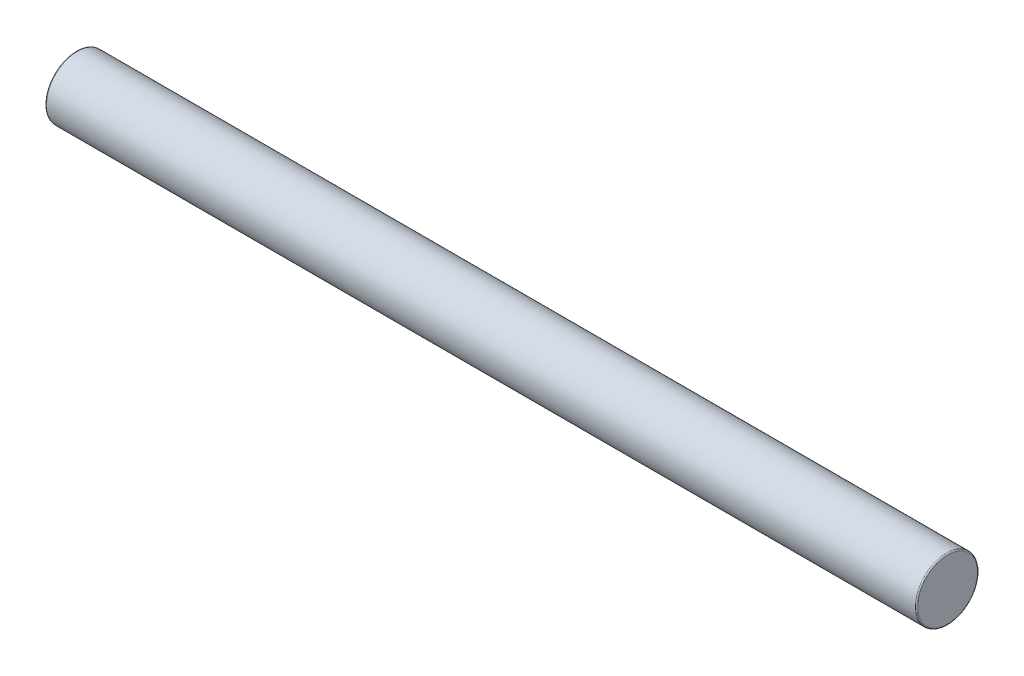
ISO-10303-21;
HEADER;
FILE_DESCRIPTION(('STEP AP214'),'2;1');
FILE_NAME('part.step','',(''),(''),'','','');
FILE_SCHEMA(('AUTOMOTIVE_DESIGN { 1 0 10303 214 1 1 1 1 }'));
ENDSEC;
DATA;
#1=APPLICATION_CONTEXT('core data for automotive mechanical design processes');
#2=APPLICATION_PROTOCOL_DEFINITION('international standard','automotive_design',2000,#1);
#3=PRODUCT_CONTEXT('',#1,'mechanical');
#4=PRODUCT('Part','Part','',(#3));
#5=PRODUCT_RELATED_PRODUCT_CATEGORY('part','',(#4));
#6=PRODUCT_DEFINITION_FORMATION('','',#4);
#7=PRODUCT_DEFINITION_CONTEXT('part definition',#1,'design');
#8=PRODUCT_DEFINITION('design','',#6,#7);
#9=PRODUCT_DEFINITION_SHAPE('','',#8);
#10=(LENGTH_UNIT() NAMED_UNIT(*) SI_UNIT(.MILLI.,.METRE.));
#11=(NAMED_UNIT(*) PLANE_ANGLE_UNIT() SI_UNIT($,.RADIAN.));
#12=(NAMED_UNIT(*) SI_UNIT($,.STERADIAN.) SOLID_ANGLE_UNIT());
#13=UNCERTAINTY_MEASURE_WITH_UNIT(LENGTH_MEASURE(1.E-05),#10,'distance_accuracy_value','');
#14=(GEOMETRIC_REPRESENTATION_CONTEXT(3) GLOBAL_UNCERTAINTY_ASSIGNED_CONTEXT((#13)) GLOBAL_UNIT_ASSIGNED_CONTEXT((#10,
#11,#12)) REPRESENTATION_CONTEXT('',''));
#15=CARTESIAN_POINT('',(0.,0.,0.));
#16=DIRECTION('',(0.,0.,1.));
#17=DIRECTION('',(1.,0.,0.));
#18=AXIS2_PLACEMENT_3D('',#15,#16,#17);
#19=CARTESIAN_POINT('',(140.,0.,0.));
#20=DIRECTION('',(-1.,0.,0.));
#21=DIRECTION('',(0.,0.,1.));
#22=AXIS2_PLACEMENT_3D('',#19,#20,#21);
#23=CYLINDRICAL_SURFACE('',#22,5.);
#24=CARTESIAN_POINT('',(139.8,0.,0.));
#25=DIRECTION('',(1.,0.,0.));
#26=DIRECTION('',(0.,0.,-1.));
#27=AXIS2_PLACEMENT_3D('',#24,#25,#26);
#28=CIRCLE('',#27,5.);
#29=CARTESIAN_POINT('',(139.8,0.,-5.));
#30=VERTEX_POINT('',#29);
#31=EDGE_CURVE('E46',#30,#30,#28,.F.);
#32=ORIENTED_EDGE('',*,*,#31,.T.);
#33=EDGE_LOOP('',(#32));
#34=FACE_BOUND('',#33,.T.);
#35=CARTESIAN_POINT('',(0.200000000000006,0.,0.));
#36=DIRECTION('',(1.,0.,0.));
#37=DIRECTION('',(0.,0.,-1.));
#38=AXIS2_PLACEMENT_3D('',#35,#36,#37);
#39=CIRCLE('',#38,5.);
#40=CARTESIAN_POINT('',(0.200000000000006,0.,-5.));
#41=VERTEX_POINT('',#40);
#42=EDGE_CURVE('E50',#41,#41,#39,.T.);
#43=ORIENTED_EDGE('',*,*,#42,.T.);
#44=EDGE_LOOP('',(#43));
#45=FACE_BOUND('',#44,.T.);
#46=ADVANCED_FACE('F39',(#34,#45),#23,.T.);
#47=CARTESIAN_POINT('',(140.,0.,0.));
#48=DIRECTION('',(1.,0.,0.));
#49=DIRECTION('',(0.,0.,-1.));
#50=AXIS2_PLACEMENT_3D('',#47,#48,#49);
#51=PLANE('',#50);
#52=CARTESIAN_POINT('',(140.,0.,0.));
#53=DIRECTION('',(1.,0.,0.));
#54=DIRECTION('',(0.,0.,-1.));
#55=AXIS2_PLACEMENT_3D('',#52,#53,#54);
#56=CIRCLE('',#55,4.8);
#57=CARTESIAN_POINT('',(140.,0.,-4.8));
#58=VERTEX_POINT('',#57);
#59=EDGE_CURVE('E54',#58,#58,#56,.T.);
#60=ORIENTED_EDGE('',*,*,#59,.T.);
#61=EDGE_LOOP('',(#60));
#62=FACE_BOUND('',#61,.T.);
#63=ADVANCED_FACE('F60',(#62),#51,.T.);
#64=CARTESIAN_POINT('',(0.,0.,0.));
#65=DIRECTION('',(1.,0.,0.));
#66=DIRECTION('',(0.,0.,-1.));
#67=AXIS2_PLACEMENT_3D('',#64,#65,#66);
#68=PLANE('',#67);
#69=CARTESIAN_POINT('',(0.,0.,0.));
#70=DIRECTION('',(1.,0.,0.));
#71=DIRECTION('',(0.,0.,-1.));
#72=AXIS2_PLACEMENT_3D('',#69,#70,#71);
#73=CIRCLE('',#72,4.8);
#74=CARTESIAN_POINT('',(0.,0.,-4.8));
#75=VERTEX_POINT('',#74);
#76=EDGE_CURVE('E10',#75,#75,#73,.F.);
#77=ORIENTED_EDGE('',*,*,#76,.T.);
#78=EDGE_LOOP('',(#77));
#79=FACE_BOUND('',#78,.T.);
#80=ADVANCED_FACE('F64',(#79),#68,.F.);
#81=CARTESIAN_POINT('',(139.8,0.,0.));
#82=DIRECTION('',(1.,0.,0.));
#83=DIRECTION('',(0.,0.,-1.));
#84=AXIS2_PLACEMENT_3D('',#81,#82,#83);
#85=TOROIDAL_SURFACE('',#84,4.8,0.2);
#86=ORIENTED_EDGE('',*,*,#31,.F.);
#87=EDGE_LOOP('',(#86));
#88=FACE_BOUND('',#87,.T.);
#89=ORIENTED_EDGE('',*,*,#59,.F.);
#90=EDGE_LOOP('',(#89));
#91=FACE_BOUND('',#90,.T.);
#92=ADVANCED_FACE('F62',(#88,#91),#85,.T.);
#93=CARTESIAN_POINT('',(0.200000000000006,0.,0.));
#94=DIRECTION('',(1.,0.,0.));
#95=DIRECTION('',(0.,0.,-1.));
#96=AXIS2_PLACEMENT_3D('',#93,#94,#95);
#97=TOROIDAL_SURFACE('',#96,4.8,0.2);
#98=ORIENTED_EDGE('',*,*,#76,.F.);
#99=EDGE_LOOP('',(#98));
#100=FACE_BOUND('',#99,.T.);
#101=ORIENTED_EDGE('',*,*,#42,.F.);
#102=EDGE_LOOP('',(#101));
#103=FACE_BOUND('',#102,.T.);
#104=ADVANCED_FACE('F41',(#100,#103),#97,.T.);
#105=CLOSED_SHELL('',(#46,#63,#80,#92,#104));
#106=MANIFOLD_SOLID_BREP('B2',#105);
#107=ADVANCED_BREP_SHAPE_REPRESENTATION('',(#18,#106),#14);
#108=SHAPE_DEFINITION_REPRESENTATION(#9,#107);
ENDSEC;
END-ISO-10303-21;
